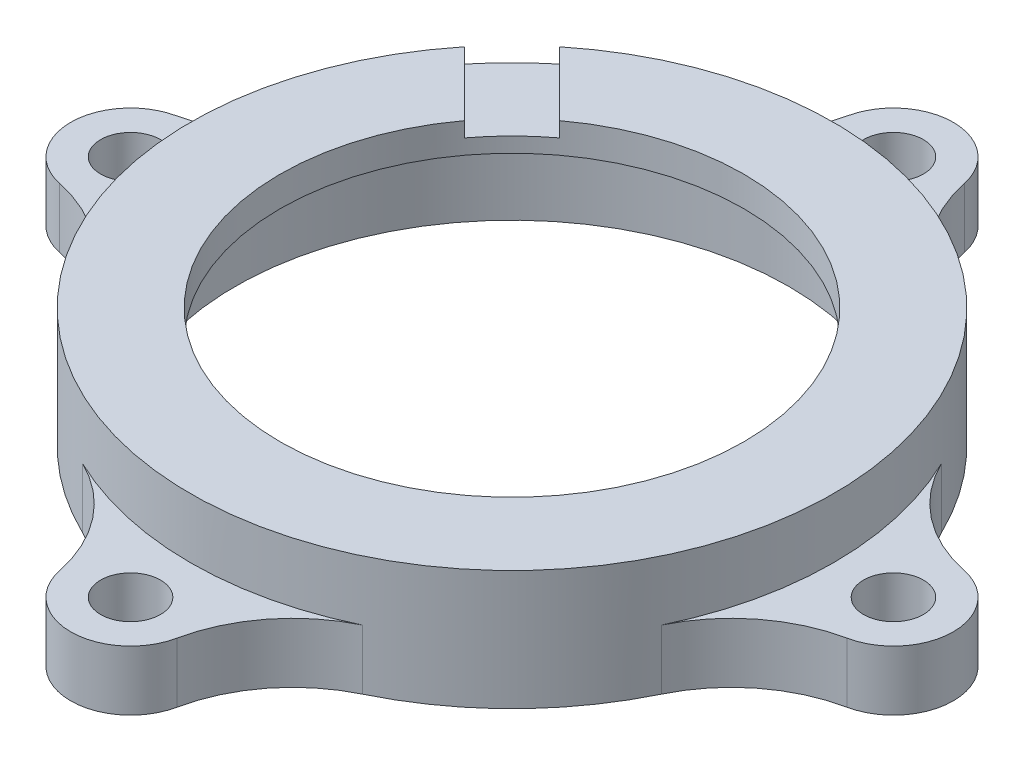
ISO-10303-21;
HEADER;
FILE_DESCRIPTION(('STEP AP214'),'2;1');
FILE_NAME('part.step','',(''),(''),'','','');
FILE_SCHEMA(('AUTOMOTIVE_DESIGN { 1 0 10303 214 1 1 1 1 }'));
ENDSEC;
DATA;
#1=APPLICATION_CONTEXT('core data for automotive mechanical design processes');
#2=APPLICATION_PROTOCOL_DEFINITION('international standard','automotive_design',2000,#1);
#3=PRODUCT_CONTEXT('',#1,'mechanical');
#4=PRODUCT('Part','Part','',(#3));
#5=PRODUCT_RELATED_PRODUCT_CATEGORY('part','',(#4));
#6=PRODUCT_DEFINITION_FORMATION('','',#4);
#7=PRODUCT_DEFINITION_CONTEXT('part definition',#1,'design');
#8=PRODUCT_DEFINITION('design','',#6,#7);
#9=PRODUCT_DEFINITION_SHAPE('','',#8);
#10=(LENGTH_UNIT() NAMED_UNIT(*) SI_UNIT(.MILLI.,.METRE.));
#11=(NAMED_UNIT(*) PLANE_ANGLE_UNIT() SI_UNIT($,.RADIAN.));
#12=(NAMED_UNIT(*) SI_UNIT($,.STERADIAN.) SOLID_ANGLE_UNIT());
#13=UNCERTAINTY_MEASURE_WITH_UNIT(LENGTH_MEASURE(1.E-05),#10,'distance_accuracy_value','');
#14=(GEOMETRIC_REPRESENTATION_CONTEXT(3) GLOBAL_UNCERTAINTY_ASSIGNED_CONTEXT((#13)) GLOBAL_UNIT_ASSIGNED_CONTEXT((#10,
#11,#12)) REPRESENTATION_CONTEXT('',''));
#15=CARTESIAN_POINT('',(0.,0.,0.));
#16=DIRECTION('',(0.,0.,1.));
#17=DIRECTION('',(1.,0.,0.));
#18=AXIS2_PLACEMENT_3D('',#15,#16,#17);
#19=CARTESIAN_POINT('',(0.,4.,0.));
#20=DIRECTION('',(0.,-1.,0.));
#21=DIRECTION('',(0.,0.,-1.));
#22=AXIS2_PLACEMENT_3D('',#19,#20,#21);
#23=CYLINDRICAL_SURFACE('',#22,15.5);
#24=DIRECTION('',(0.,-1.,0.));
#25=VECTOR('',#24,1.);
#26=CARTESIAN_POINT('',(-12.4350554548179,4.,-9.25307493947836));
#27=LINE('',#26,#25);
#28=CARTESIAN_POINT('',(-12.4350554548179,4.,-9.25307493947836));
#29=VERTEX_POINT('',#28);
#30=CARTESIAN_POINT('',(-12.4350554548179,3.,-9.25307493947836));
#31=VERTEX_POINT('',#30);
#32=EDGE_CURVE('E181',#29,#31,#27,.T.);
#33=ORIENTED_EDGE('',*,*,#32,.F.);
#34=CARTESIAN_POINT('',(0.,4.,0.));
#35=DIRECTION('',(0.,1.,0.));
#36=DIRECTION('',(0.,0.,1.));
#37=AXIS2_PLACEMENT_3D('',#34,#35,#36);
#38=CIRCLE('',#37,15.5);
#39=CARTESIAN_POINT('',(-9.2530749394785,4.,-12.4350554548178));
#40=VERTEX_POINT('',#39);
#41=EDGE_CURVE('E189',#29,#40,#38,.T.);
#42=ORIENTED_EDGE('',*,*,#41,.T.);
#43=DIRECTION('',(0.,-1.,0.));
#44=VECTOR('',#43,1.);
#45=CARTESIAN_POINT('',(-9.2530749394785,4.,-12.4350554548178));
#46=LINE('',#45,#44);
#47=CARTESIAN_POINT('',(-9.2530749394785,3.,-12.4350554548178));
#48=VERTEX_POINT('',#47);
#49=EDGE_CURVE('E173',#48,#40,#46,.F.);
#50=ORIENTED_EDGE('',*,*,#49,.F.);
#51=CARTESIAN_POINT('',(0.,3.,0.));
#52=DIRECTION('',(0.,-1.,0.));
#53=DIRECTION('',(0.,0.,-1.));
#54=AXIS2_PLACEMENT_3D('',#51,#52,#53);
#55=CIRCLE('',#54,15.5);
#56=EDGE_CURVE('E182',#31,#48,#55,.T.);
#57=ORIENTED_EDGE('',*,*,#56,.F.);
#58=EDGE_LOOP('',(#33,#42,#50,#57));
#59=FACE_BOUND('',#58,.T.);
#60=CARTESIAN_POINT('',(0.,2.,0.));
#61=DIRECTION('',(0.,-1.,0.));
#62=DIRECTION('',(0.,0.,-1.));
#63=AXIS2_PLACEMENT_3D('',#60,#61,#62);
#64=CIRCLE('',#63,15.5);
#65=CARTESIAN_POINT('',(0.,2.,-15.5));
#66=VERTEX_POINT('',#65);
#67=EDGE_CURVE('E206',#66,#66,#64,.T.);
#68=ORIENTED_EDGE('',*,*,#67,.T.);
#69=EDGE_LOOP('',(#68));
#70=FACE_BOUND('',#69,.T.);
#71=ADVANCED_FACE('F36',(#59,#70),#23,.F.);
#72=CARTESIAN_POINT('',(0.,4.,0.));
#73=DIRECTION('',(0.,1.,0.));
#74=DIRECTION('',(0.,0.,1.));
#75=AXIS2_PLACEMENT_3D('',#72,#73,#74);
#76=PLANE('',#75);
#77=DIRECTION('',(0.707106781186548,0.,0.707106781186547));
#78=VECTOR('',#77,1.);
#79=CARTESIAN_POINT('',(-11.849248678401,4.,-8.66726816306138));
#80=LINE('',#79,#78);
#81=CARTESIAN_POINT('',(-16.7103073718783,4.,-13.5283268565388));
#82=VERTEX_POINT('',#81);
#83=EDGE_CURVE('E192',#82,#29,#80,.T.);
#84=ORIENTED_EDGE('',*,*,#83,.F.);
#85=CARTESIAN_POINT('',(0.,4.,0.));
#86=DIRECTION('',(0.,1.,0.));
#87=DIRECTION('',(0.,0.,1.));
#88=AXIS2_PLACEMENT_3D('',#85,#86,#87);
#89=CIRCLE('',#88,21.5);
#90=CARTESIAN_POINT('',(-13.5283268565389,4.,-16.7103073718782));
#91=VERTEX_POINT('',#90);
#92=EDGE_CURVE('E191',#82,#91,#89,.T.);
#93=ORIENTED_EDGE('',*,*,#92,.T.);
#94=DIRECTION('',(-0.707106781186548,0.,-0.707106781186547));
#95=VECTOR('',#94,1.);
#96=CARTESIAN_POINT('',(-8.6672681630615,4.,-11.8492486784008));
#97=LINE('',#96,#95);
#98=EDGE_CURVE('E176',#40,#91,#97,.T.);
#99=ORIENTED_EDGE('',*,*,#98,.F.);
#100=ORIENTED_EDGE('',*,*,#41,.F.);
#101=EDGE_LOOP('',(#84,#93,#99,#100));
#102=FACE_BOUND('',#101,.T.);
#103=ADVANCED_FACE('F188',(#102),#76,.T.);
#104=CARTESIAN_POINT('',(0.,4.,0.));
#105=DIRECTION('',(0.,-1.,0.));
#106=DIRECTION('',(0.,0.,-1.));
#107=AXIS2_PLACEMENT_3D('',#104,#105,#106);
#108=CYLINDRICAL_SURFACE('',#107,21.5);
#109=ORIENTED_EDGE('',*,*,#92,.F.);
#110=DIRECTION('',(0.,-1.,0.));
#111=VECTOR('',#110,1.);
#112=CARTESIAN_POINT('',(-16.7103073718783,4.,-13.5283268565388));
#113=LINE('',#112,#111);
#114=CARTESIAN_POINT('',(-16.7103073718783,3.,-13.5283268565388));
#115=VERTEX_POINT('',#114);
#116=EDGE_CURVE('E11',#82,#115,#113,.T.);
#117=ORIENTED_EDGE('',*,*,#116,.T.);
#118=CARTESIAN_POINT('',(0.,3.,0.));
#119=DIRECTION('',(0.,-1.,0.));
#120=DIRECTION('',(0.,0.,-1.));
#121=AXIS2_PLACEMENT_3D('',#118,#119,#120);
#122=CIRCLE('',#121,21.5);
#123=CARTESIAN_POINT('',(-13.5283268565389,3.,-16.7103073718782));
#124=VERTEX_POINT('',#123);
#125=EDGE_CURVE('E293',#115,#124,#122,.T.);
#126=ORIENTED_EDGE('',*,*,#125,.T.);
#127=DIRECTION('',(0.,-1.,0.));
#128=VECTOR('',#127,1.);
#129=CARTESIAN_POINT('',(-13.5283268565389,4.,-16.7103073718782));
#130=LINE('',#129,#128);
#131=EDGE_CURVE('E44',#124,#91,#130,.F.);
#132=ORIENTED_EDGE('',*,*,#131,.T.);
#133=EDGE_LOOP('',(#109,#117,#126,#132));
#134=FACE_BOUND('',#133,.T.);
#135=CARTESIAN_POINT('',(0.,-4.,0.));
#136=DIRECTION('',(0.,-1.,0.));
#137=DIRECTION('',(0.,0.,-1.));
#138=AXIS2_PLACEMENT_3D('',#135,#136,#137);
#139=CIRCLE('',#138,21.5);
#140=CARTESIAN_POINT('',(-9.35365017871444,-4.,19.3586990351685));
#141=VERTEX_POINT('',#140);
#142=CARTESIAN_POINT('',(-19.3586990351696,-4.,9.3536501787122));
#143=VERTEX_POINT('',#142);
#144=EDGE_CURVE('E203',#141,#143,#139,.T.);
#145=ORIENTED_EDGE('',*,*,#144,.F.);
#146=DIRECTION('',(0.,-1.,0.));
#147=VECTOR('',#146,1.);
#148=CARTESIAN_POINT('',(-9.35365017871444,4.,19.3586990351685));
#149=LINE('',#148,#147);
#150=CARTESIAN_POINT('',(-9.35365017871444,0.,19.3586990351685));
#151=VERTEX_POINT('',#150);
#152=EDGE_CURVE('E239',#141,#151,#149,.F.);
#153=ORIENTED_EDGE('',*,*,#152,.T.);
#154=CARTESIAN_POINT('',(0.,0.,0.));
#155=DIRECTION('',(0.,-1.,0.));
#156=DIRECTION('',(0.,0.,-1.));
#157=AXIS2_PLACEMENT_3D('',#154,#155,#156);
#158=CIRCLE('',#157,21.5);
#159=CARTESIAN_POINT('',(9.35365017871107,0.,19.3586990351702));
#160=VERTEX_POINT('',#159);
#161=EDGE_CURVE('E212',#160,#151,#158,.T.);
#162=ORIENTED_EDGE('',*,*,#161,.F.);
#163=DIRECTION('',(0.,-1.,0.));
#164=VECTOR('',#163,1.);
#165=CARTESIAN_POINT('',(9.35365017871107,4.,19.3586990351702));
#166=LINE('',#165,#164);
#167=CARTESIAN_POINT('',(9.35365017871107,-4.,19.3586990351702));
#168=VERTEX_POINT('',#167);
#169=EDGE_CURVE('E218',#160,#168,#166,.T.);
#170=ORIENTED_EDGE('',*,*,#169,.T.);
#171=CARTESIAN_POINT('',(19.3586990351674,-4.,9.35365017871677));
#172=VERTEX_POINT('',#171);
#173=EDGE_CURVE('E362',#172,#168,#139,.T.);
#174=ORIENTED_EDGE('',*,*,#173,.F.);
#175=DIRECTION('',(0.,-1.,0.));
#176=VECTOR('',#175,1.);
#177=CARTESIAN_POINT('',(19.3586990351674,4.,9.35365017871677));
#178=LINE('',#177,#176);
#179=CARTESIAN_POINT('',(19.3586990351674,0.,9.35365017871677));
#180=VERTEX_POINT('',#179);
#181=EDGE_CURVE('E221',#172,#180,#178,.F.);
#182=ORIENTED_EDGE('',*,*,#181,.T.);
#183=CARTESIAN_POINT('',(0.,0.,0.));
#184=DIRECTION('',(0.,-1.,0.));
#185=DIRECTION('',(0.,0.,-1.));
#186=AXIS2_PLACEMENT_3D('',#183,#184,#185);
#187=CIRCLE('',#186,21.5);
#188=CARTESIAN_POINT('',(19.3586990351716,0.,-9.35365017870804));
#189=VERTEX_POINT('',#188);
#190=EDGE_CURVE('E214',#189,#180,#187,.T.);
#191=ORIENTED_EDGE('',*,*,#190,.F.);
#192=DIRECTION('',(0.,-1.,0.));
#193=VECTOR('',#192,1.);
#194=CARTESIAN_POINT('',(19.3586990351716,4.,-9.35365017870804));
#195=LINE('',#194,#193);
#196=CARTESIAN_POINT('',(19.3586990351716,-4.,-9.35365017870804));
#197=VERTEX_POINT('',#196);
#198=EDGE_CURVE('E224',#189,#197,#195,.T.);
#199=ORIENTED_EDGE('',*,*,#198,.T.);
#200=CARTESIAN_POINT('',(9.35365017871453,-4.,-19.3586990351685));
#201=VERTEX_POINT('',#200);
#202=EDGE_CURVE('E201',#201,#197,#139,.T.);
#203=ORIENTED_EDGE('',*,*,#202,.F.);
#204=DIRECTION('',(0.,-1.,0.));
#205=VECTOR('',#204,1.);
#206=CARTESIAN_POINT('',(9.35365017871453,4.,-19.3586990351685));
#207=LINE('',#206,#205);
#208=CARTESIAN_POINT('',(9.35365017871453,0.,-19.3586990351685));
#209=VERTEX_POINT('',#208);
#210=EDGE_CURVE('E236',#201,#209,#207,.F.);
#211=ORIENTED_EDGE('',*,*,#210,.T.);
#212=CARTESIAN_POINT('',(0.,0.,0.));
#213=DIRECTION('',(0.,-1.,0.));
#214=DIRECTION('',(0.,0.,-1.));
#215=AXIS2_PLACEMENT_3D('',#212,#213,#214);
#216=CIRCLE('',#215,21.5);
#217=CARTESIAN_POINT('',(-9.35365017870916,0.,-19.3586990351711));
#218=VERTEX_POINT('',#217);
#219=EDGE_CURVE('E216',#218,#209,#216,.T.);
#220=ORIENTED_EDGE('',*,*,#219,.F.);
#221=DIRECTION('',(0.,-1.,0.));
#222=VECTOR('',#221,1.);
#223=CARTESIAN_POINT('',(-9.35365017870916,4.,-19.3586990351711));
#224=LINE('',#223,#222);
#225=CARTESIAN_POINT('',(-9.35365017870916,-4.,-19.3586990351711));
#226=VERTEX_POINT('',#225);
#227=EDGE_CURVE('E227',#218,#226,#224,.T.);
#228=ORIENTED_EDGE('',*,*,#227,.T.);
#229=CARTESIAN_POINT('',(-19.3586990351696,-4.,-9.3536501787122));
#230=VERTEX_POINT('',#229);
#231=EDGE_CURVE('E196',#230,#226,#139,.T.);
#232=ORIENTED_EDGE('',*,*,#231,.F.);
#233=DIRECTION('',(0.,-1.,0.));
#234=VECTOR('',#233,1.);
#235=CARTESIAN_POINT('',(-19.3586990351696,4.,-9.3536501787122));
#236=LINE('',#235,#234);
#237=CARTESIAN_POINT('',(-19.3586990351696,0.,-9.3536501787122));
#238=VERTEX_POINT('',#237);
#239=EDGE_CURVE('E233',#230,#238,#236,.F.);
#240=ORIENTED_EDGE('',*,*,#239,.T.);
#241=CARTESIAN_POINT('',(0.,0.,0.));
#242=DIRECTION('',(0.,-1.,0.));
#243=DIRECTION('',(0.,0.,-1.));
#244=AXIS2_PLACEMENT_3D('',#241,#242,#243);
#245=CIRCLE('',#244,21.5);
#246=CARTESIAN_POINT('',(-19.3586990351696,0.,9.3536501787122));
#247=VERTEX_POINT('',#246);
#248=EDGE_CURVE('E198',#247,#238,#245,.T.);
#249=ORIENTED_EDGE('',*,*,#248,.F.);
#250=DIRECTION('',(0.,-1.,0.));
#251=VECTOR('',#250,1.);
#252=CARTESIAN_POINT('',(-19.3586990351696,4.,9.3536501787122));
#253=LINE('',#252,#251);
#254=EDGE_CURVE('E230',#247,#143,#253,.T.);
#255=ORIENTED_EDGE('',*,*,#254,.T.);
#256=EDGE_LOOP('',(#145,#153,#162,#170,#174,#182,#191,#199,#203,#211,#220,#228,#232,#240,#249,#255));
#257=FACE_BOUND('',#256,.T.);
#258=ADVANCED_FACE('F296',(#134,#257),#108,.T.);
#259=CARTESIAN_POINT('',(0.,-4.,0.));
#260=DIRECTION('',(0.,-1.,0.));
#261=DIRECTION('',(0.,0.,-1.));
#262=AXIS2_PLACEMENT_3D('',#259,#260,#261);
#263=PLANE('',#262);
#264=CARTESIAN_POINT('',(-25.5,-4.,0.));
#265=DIRECTION('',(0.,-1.,0.));
#266=DIRECTION('',(0.,0.,-1.));
#267=AXIS2_PLACEMENT_3D('',#264,#265,#266);
#268=CIRCLE('',#267,4.);
#269=CARTESIAN_POINT('',(-26.3179271708683,-4.,3.91548147015859));
#270=VERTEX_POINT('',#269);
#271=CARTESIAN_POINT('',(-26.3179271708683,-4.,-3.91548147015859));
#272=VERTEX_POINT('',#271);
#273=EDGE_CURVE('E349',#270,#272,#268,.T.);
#274=ORIENTED_EDGE('',*,*,#273,.T.);
#275=CARTESIAN_POINT('',(-28.3627450980392,-4.,-13.7041851455551));
#276=DIRECTION('',(0.,-1.,0.));
#277=DIRECTION('',(0.,0.,-1.));
#278=AXIS2_PLACEMENT_3D('',#275,#276,#277);
#279=CIRCLE('',#278,10.);
#280=EDGE_CURVE('E268',#272,#230,#279,.F.);
#281=ORIENTED_EDGE('',*,*,#280,.T.);
#282=ORIENTED_EDGE('',*,*,#231,.T.);
#283=CARTESIAN_POINT('',(-13.7041851455506,-4.,-28.3627450980414));
#284=DIRECTION('',(0.,-1.,0.));
#285=DIRECTION('',(0.,0.,-1.));
#286=AXIS2_PLACEMENT_3D('',#283,#284,#285);
#287=CIRCLE('',#286,10.);
#288=CARTESIAN_POINT('',(-3.9154814701548,-4.,-26.3179271708674));
#289=VERTEX_POINT('',#288);
#290=EDGE_CURVE('E275',#226,#289,#287,.F.);
#291=ORIENTED_EDGE('',*,*,#290,.T.);
#292=CARTESIAN_POINT('',(3.53571390935753E-12,-4.,-25.4999999999978));
#293=DIRECTION('',(0.,-1.,0.));
#294=DIRECTION('',(0.,0.,-1.));
#295=AXIS2_PLACEMENT_3D('',#292,#293,#294);
#296=CIRCLE('',#295,4.);
#297=CARTESIAN_POINT('',(3.9154814701621,-4.,-26.3179271708663));
#298=VERTEX_POINT('',#297);
#299=EDGE_CURVE('E311',#289,#298,#296,.T.);
#300=ORIENTED_EDGE('',*,*,#299,.T.);
#301=CARTESIAN_POINT('',(13.7041851455585,-4.,-28.3627450980376));
#302=DIRECTION('',(0.,-1.,0.));
#303=DIRECTION('',(0.,0.,-1.));
#304=AXIS2_PLACEMENT_3D('',#301,#302,#303);
#305=CIRCLE('',#304,10.);
#306=EDGE_CURVE('E264',#298,#201,#305,.F.);
#307=ORIENTED_EDGE('',*,*,#306,.T.);
#308=ORIENTED_EDGE('',*,*,#202,.T.);
#309=CARTESIAN_POINT('',(28.3627450980422,-4.,-13.704185145549));
#310=DIRECTION('',(0.,-1.,0.));
#311=DIRECTION('',(0.,0.,-1.));
#312=AXIS2_PLACEMENT_3D('',#309,#310,#311);
#313=CIRCLE('',#312,10.);
#314=CARTESIAN_POINT('',(26.3179271708701,-4.,-3.91548147015274));
#315=VERTEX_POINT('',#314);
#316=EDGE_CURVE('E280',#197,#315,#313,.F.);
#317=ORIENTED_EDGE('',*,*,#316,.T.);
#318=CARTESIAN_POINT('',(25.5000000000013,-4.,5.75373117220094E-12));
#319=DIRECTION('',(0.,-1.,0.));
#320=DIRECTION('',(0.,0.,-1.));
#321=AXIS2_PLACEMENT_3D('',#318,#319,#320);
#322=CIRCLE('',#321,4.);
#323=CARTESIAN_POINT('',(26.3179271708684,-4.,3.91548147016462));
#324=VERTEX_POINT('',#323);
#325=EDGE_CURVE('E323',#315,#324,#322,.T.);
#326=ORIENTED_EDGE('',*,*,#325,.T.);
#327=CARTESIAN_POINT('',(28.362745098036,-4.,13.7041851455618));
#328=DIRECTION('',(0.,-1.,0.));
#329=DIRECTION('',(0.,0.,-1.));
#330=AXIS2_PLACEMENT_3D('',#327,#328,#329);
#331=CIRCLE('',#330,10.);
#332=EDGE_CURVE('E286',#324,#172,#331,.F.);
#333=ORIENTED_EDGE('',*,*,#332,.T.);
#334=ORIENTED_EDGE('',*,*,#173,.T.);
#335=CARTESIAN_POINT('',(13.7041851455534,-4.,28.36274509804));
#336=DIRECTION('',(0.,-1.,0.));
#337=DIRECTION('',(0.,0.,-1.));
#338=AXIS2_PLACEMENT_3D('',#335,#336,#337);
#339=CIRCLE('',#338,10.);
#340=CARTESIAN_POINT('',(3.91548147015654,-4.,26.3179271708711));
#341=VERTEX_POINT('',#340);
#342=EDGE_CURVE('E288',#168,#341,#339,.F.);
#343=ORIENTED_EDGE('',*,*,#342,.T.);
#344=CARTESIAN_POINT('',(-2.22114011218124E-12,-4.,25.5000000000035));
#345=DIRECTION('',(0.,-1.,0.));
#346=DIRECTION('',(0.,0.,-1.));
#347=AXIS2_PLACEMENT_3D('',#344,#345,#346);
#348=CIRCLE('',#347,4.);
#349=CARTESIAN_POINT('',(-3.91548147016112,-4.,26.3179271708704));
#350=VERTEX_POINT('',#349);
#351=EDGE_CURVE('E334',#341,#350,#348,.T.);
#352=ORIENTED_EDGE('',*,*,#351,.T.);
#353=CARTESIAN_POINT('',(-13.7041851455584,-4.,28.3627450980376));
#354=DIRECTION('',(0.,-1.,0.));
#355=DIRECTION('',(0.,0.,-1.));
#356=AXIS2_PLACEMENT_3D('',#353,#354,#355);
#357=CIRCLE('',#356,10.);
#358=EDGE_CURVE('E260',#350,#141,#357,.F.);
#359=ORIENTED_EDGE('',*,*,#358,.T.);
#360=ORIENTED_EDGE('',*,*,#144,.T.);
#361=CARTESIAN_POINT('',(-28.3627450980392,-4.,13.7041851455551));
#362=DIRECTION('',(0.,-1.,0.));
#363=DIRECTION('',(0.,0.,-1.));
#364=AXIS2_PLACEMENT_3D('',#361,#362,#363);
#365=CIRCLE('',#364,10.);
#366=EDGE_CURVE('E270',#143,#270,#365,.F.);
#367=ORIENTED_EDGE('',*,*,#366,.T.);
#368=EDGE_LOOP('',(#274,#281,#282,#291,#300,#307,#308,#317,#326,#333,#334,#343,#352,#359,#360,#367));
#369=FACE_BOUND('',#368,.T.);
#370=CARTESIAN_POINT('',(0.,-4.,0.));
#371=DIRECTION('',(0.,-1.,0.));
#372=DIRECTION('',(0.,0.,-1.));
#373=AXIS2_PLACEMENT_3D('',#370,#371,#372);
#374=CIRCLE('',#373,18.5);
#375=CARTESIAN_POINT('',(0.,-4.,-18.5));
#376=VERTEX_POINT('',#375);
#377=EDGE_CURVE('E209',#376,#376,#374,.T.);
#378=ORIENTED_EDGE('',*,*,#377,.F.);
#379=EDGE_LOOP('',(#378));
#380=FACE_BOUND('',#379,.T.);
#381=CARTESIAN_POINT('',(-25.5,-4.,0.));
#382=DIRECTION('',(0.,-1.,0.));
#383=DIRECTION('',(0.,0.,-1.));
#384=AXIS2_PLACEMENT_3D('',#381,#382,#383);
#385=CIRCLE('',#384,2.);
#386=CARTESIAN_POINT('',(-25.5,-4.,-2.));
#387=VERTEX_POINT('',#386);
#388=EDGE_CURVE('E343',#387,#387,#385,.T.);
#389=ORIENTED_EDGE('',*,*,#388,.F.);
#390=EDGE_LOOP('',(#389));
#391=FACE_BOUND('',#390,.T.);
#392=CARTESIAN_POINT('',(-2.22114011218124E-12,-4.,25.5000000000035));
#393=DIRECTION('',(0.,-1.,0.));
#394=DIRECTION('',(0.,0.,-1.));
#395=AXIS2_PLACEMENT_3D('',#392,#393,#394);
#396=CIRCLE('',#395,2.);
#397=CARTESIAN_POINT('',(-2.22114011218124E-12,-4.,23.5000000000035));
#398=VERTEX_POINT('',#397);
#399=EDGE_CURVE('E340',#398,#398,#396,.T.);
#400=ORIENTED_EDGE('',*,*,#399,.F.);
#401=EDGE_LOOP('',(#400));
#402=FACE_BOUND('',#401,.T.);
#403=CARTESIAN_POINT('',(25.5000000000013,-4.,5.75373117220094E-12));
#404=DIRECTION('',(0.,-1.,0.));
#405=DIRECTION('',(0.,0.,-1.));
#406=AXIS2_PLACEMENT_3D('',#403,#404,#405);
#407=CIRCLE('',#406,2.);
#408=CARTESIAN_POINT('',(25.5000000000013,-4.,-1.99999999999425));
#409=VERTEX_POINT('',#408);
#410=EDGE_CURVE('E328',#409,#409,#407,.T.);
#411=ORIENTED_EDGE('',*,*,#410,.F.);
#412=EDGE_LOOP('',(#411));
#413=FACE_BOUND('',#412,.T.);
#414=CARTESIAN_POINT('',(3.53571390935753E-12,-4.,-25.4999999999978));
#415=DIRECTION('',(0.,-1.,0.));
#416=DIRECTION('',(0.,0.,-1.));
#417=AXIS2_PLACEMENT_3D('',#414,#415,#416);
#418=CIRCLE('',#417,2.);
#419=CARTESIAN_POINT('',(3.53571390935753E-12,-4.,-27.4999999999978));
#420=VERTEX_POINT('',#419);
#421=EDGE_CURVE('E317',#420,#420,#418,.T.);
#422=ORIENTED_EDGE('',*,*,#421,.F.);
#423=EDGE_LOOP('',(#422));
#424=FACE_BOUND('',#423,.T.);
#425=ADVANCED_FACE('F369',(#369,#380,#391,#402,#413,#424),#263,.T.);
#426=CARTESIAN_POINT('',(0.,-4.,0.));
#427=DIRECTION('',(0.,1.,0.));
#428=DIRECTION('',(0.,0.,1.));
#429=AXIS2_PLACEMENT_3D('',#426,#427,#428);
#430=CYLINDRICAL_SURFACE('',#429,18.5);
#431=ORIENTED_EDGE('',*,*,#377,.T.);
#432=EDGE_LOOP('',(#431));
#433=FACE_BOUND('',#432,.T.);
#434=CARTESIAN_POINT('',(0.,2.,0.));
#435=DIRECTION('',(0.,-1.,0.));
#436=DIRECTION('',(0.,0.,-1.));
#437=AXIS2_PLACEMENT_3D('',#434,#435,#436);
#438=CIRCLE('',#437,18.5);
#439=CARTESIAN_POINT('',(0.,2.,-18.5));
#440=VERTEX_POINT('',#439);
#441=EDGE_CURVE('E210',#440,#440,#438,.T.);
#442=ORIENTED_EDGE('',*,*,#441,.F.);
#443=EDGE_LOOP('',(#442));
#444=FACE_BOUND('',#443,.T.);
#445=ADVANCED_FACE('F418',(#433,#444),#430,.F.);
#446=CARTESIAN_POINT('',(0.,2.,0.));
#447=DIRECTION('',(0.,-1.,0.));
#448=DIRECTION('',(0.,0.,-1.));
#449=AXIS2_PLACEMENT_3D('',#446,#447,#448);
#450=PLANE('',#449);
#451=ORIENTED_EDGE('',*,*,#67,.F.);
#452=EDGE_LOOP('',(#451));
#453=FACE_BOUND('',#452,.T.);
#454=ORIENTED_EDGE('',*,*,#441,.T.);
#455=EDGE_LOOP('',(#454));
#456=FACE_BOUND('',#455,.T.);
#457=ADVANCED_FACE('F409',(#453,#456),#450,.T.);
#458=CARTESIAN_POINT('',(-25.5,0.,0.));
#459=DIRECTION('',(0.,-1.,0.));
#460=DIRECTION('',(0.,0.,-1.));
#461=AXIS2_PLACEMENT_3D('',#458,#459,#460);
#462=CYLINDRICAL_SURFACE('',#461,4.);
#463=CARTESIAN_POINT('',(-25.5,0.,0.));
#464=DIRECTION('',(0.,-1.,0.));
#465=DIRECTION('',(0.,0.,-1.));
#466=AXIS2_PLACEMENT_3D('',#463,#464,#465);
#467=CIRCLE('',#466,4.);
#468=CARTESIAN_POINT('',(-26.3179271708683,0.,3.91548147015859));
#469=VERTEX_POINT('',#468);
#470=CARTESIAN_POINT('',(-26.3179271708683,0.,-3.91548147015859));
#471=VERTEX_POINT('',#470);
#472=EDGE_CURVE('E352',#469,#471,#467,.T.);
#473=ORIENTED_EDGE('',*,*,#472,.T.);
#474=DIRECTION('',(0.,-1.,0.));
#475=VECTOR('',#474,1.);
#476=CARTESIAN_POINT('',(-26.3179271708683,0.,-3.9154814701586));
#477=LINE('',#476,#475);
#478=EDGE_CURVE('E252',#471,#272,#477,.T.);
#479=ORIENTED_EDGE('',*,*,#478,.T.);
#480=ORIENTED_EDGE('',*,*,#273,.F.);
#481=DIRECTION('',(0.,-1.,0.));
#482=VECTOR('',#481,1.);
#483=CARTESIAN_POINT('',(-26.3179271708683,0.,3.9154814701586));
#484=LINE('',#483,#482);
#485=EDGE_CURVE('E250',#270,#469,#484,.F.);
#486=ORIENTED_EDGE('',*,*,#485,.T.);
#487=EDGE_LOOP('',(#473,#479,#480,#486));
#488=FACE_BOUND('',#487,.T.);
#489=ADVANCED_FACE('F407',(#488),#462,.T.);
#490=CARTESIAN_POINT('',(-25.5,0.,0.));
#491=DIRECTION('',(0.,-1.,0.));
#492=DIRECTION('',(0.,0.,-1.));
#493=AXIS2_PLACEMENT_3D('',#490,#491,#492);
#494=PLANE('',#493);
#495=CARTESIAN_POINT('',(-25.5,0.,0.));
#496=DIRECTION('',(0.,-1.,0.));
#497=DIRECTION('',(0.,0.,-1.));
#498=AXIS2_PLACEMENT_3D('',#495,#496,#497);
#499=CIRCLE('',#498,2.);
#500=CARTESIAN_POINT('',(-25.5,0.,-2.));
#501=VERTEX_POINT('',#500);
#502=EDGE_CURVE('E346',#501,#501,#499,.T.);
#503=ORIENTED_EDGE('',*,*,#502,.T.);
#504=EDGE_LOOP('',(#503));
#505=FACE_BOUND('',#504,.T.);
#506=ORIENTED_EDGE('',*,*,#472,.F.);
#507=CARTESIAN_POINT('',(-28.3627450980392,0.,13.7041851455551));
#508=DIRECTION('',(0.,-1.,0.));
#509=DIRECTION('',(0.,0.,-1.));
#510=AXIS2_PLACEMENT_3D('',#507,#508,#509);
#511=CIRCLE('',#510,10.);
#512=EDGE_CURVE('E272',#469,#247,#511,.T.);
#513=ORIENTED_EDGE('',*,*,#512,.T.);
#514=ORIENTED_EDGE('',*,*,#248,.T.);
#515=CARTESIAN_POINT('',(-28.3627450980392,0.,-13.7041851455551));
#516=DIRECTION('',(0.,-1.,0.));
#517=DIRECTION('',(0.,0.,-1.));
#518=AXIS2_PLACEMENT_3D('',#515,#516,#517);
#519=CIRCLE('',#518,10.);
#520=EDGE_CURVE('E266',#238,#471,#519,.T.);
#521=ORIENTED_EDGE('',*,*,#520,.T.);
#522=EDGE_LOOP('',(#506,#513,#514,#521));
#523=FACE_BOUND('',#522,.T.);
#524=ADVANCED_FACE('F402',(#505,#523),#494,.F.);
#525=CARTESIAN_POINT('',(-25.5,0.,0.));
#526=DIRECTION('',(0.,-1.,0.));
#527=DIRECTION('',(0.,0.,-1.));
#528=AXIS2_PLACEMENT_3D('',#525,#526,#527);
#529=CYLINDRICAL_SURFACE('',#528,2.);
#530=ORIENTED_EDGE('',*,*,#502,.F.);
#531=EDGE_LOOP('',(#530));
#532=FACE_BOUND('',#531,.T.);
#533=ORIENTED_EDGE('',*,*,#388,.T.);
#534=EDGE_LOOP('',(#533));
#535=FACE_BOUND('',#534,.T.);
#536=ADVANCED_FACE('F415',(#532,#535),#529,.F.);
#537=CARTESIAN_POINT('',(-2.22114011218124E-12,0.,25.5000000000035));
#538=DIRECTION('',(0.,-1.,0.));
#539=DIRECTION('',(0.,0.,-1.));
#540=AXIS2_PLACEMENT_3D('',#537,#538,#539);
#541=CYLINDRICAL_SURFACE('',#540,4.);
#542=CARTESIAN_POINT('',(-2.22114011218124E-12,0.,25.5000000000035));
#543=DIRECTION('',(0.,-1.,0.));
#544=DIRECTION('',(0.,0.,-1.));
#545=AXIS2_PLACEMENT_3D('',#542,#543,#544);
#546=CIRCLE('',#545,4.);
#547=CARTESIAN_POINT('',(3.91548147015654,0.,26.3179271708711));
#548=VERTEX_POINT('',#547);
#549=CARTESIAN_POINT('',(-3.91548147016112,0.,26.3179271708704));
#550=VERTEX_POINT('',#549);
#551=EDGE_CURVE('E331',#548,#550,#546,.T.);
#552=ORIENTED_EDGE('',*,*,#551,.T.);
#553=DIRECTION('',(0.,-1.,0.));
#554=VECTOR('',#553,1.);
#555=CARTESIAN_POINT('',(-3.91548147016112,0.,26.3179271708704));
#556=LINE('',#555,#554);
#557=EDGE_CURVE('E244',#550,#350,#556,.T.);
#558=ORIENTED_EDGE('',*,*,#557,.T.);
#559=ORIENTED_EDGE('',*,*,#351,.F.);
#560=DIRECTION('',(0.,-1.,0.));
#561=VECTOR('',#560,1.);
#562=CARTESIAN_POINT('',(3.91548147015654,0.,26.3179271708711));
#563=LINE('',#562,#561);
#564=EDGE_CURVE('E242',#341,#548,#563,.F.);
#565=ORIENTED_EDGE('',*,*,#564,.T.);
#566=EDGE_LOOP('',(#552,#558,#559,#565));
#567=FACE_BOUND('',#566,.T.);
#568=ADVANCED_FACE('F464',(#567),#541,.T.);
#569=CARTESIAN_POINT('',(-2.22114011218124E-12,0.,25.5000000000035));
#570=DIRECTION('',(0.,-1.,0.));
#571=DIRECTION('',(0.,0.,-1.));
#572=AXIS2_PLACEMENT_3D('',#569,#570,#571);
#573=PLANE('',#572);
#574=CARTESIAN_POINT('',(-2.22114011218124E-12,0.,25.5000000000035));
#575=DIRECTION('',(0.,-1.,0.));
#576=DIRECTION('',(0.,0.,-1.));
#577=AXIS2_PLACEMENT_3D('',#574,#575,#576);
#578=CIRCLE('',#577,2.);
#579=CARTESIAN_POINT('',(-2.22114011218124E-12,0.,23.5000000000035));
#580=VERTEX_POINT('',#579);
#581=EDGE_CURVE('E337',#580,#580,#578,.T.);
#582=ORIENTED_EDGE('',*,*,#581,.T.);
#583=EDGE_LOOP('',(#582));
#584=FACE_BOUND('',#583,.T.);
#585=ORIENTED_EDGE('',*,*,#551,.F.);
#586=CARTESIAN_POINT('',(13.7041851455534,0.,28.36274509804));
#587=DIRECTION('',(0.,-1.,0.));
#588=DIRECTION('',(0.,0.,-1.));
#589=AXIS2_PLACEMENT_3D('',#586,#587,#588);
#590=CIRCLE('',#589,10.);
#591=EDGE_CURVE('E290',#548,#160,#590,.T.);
#592=ORIENTED_EDGE('',*,*,#591,.T.);
#593=ORIENTED_EDGE('',*,*,#161,.T.);
#594=CARTESIAN_POINT('',(-13.7041851455584,0.,28.3627450980376));
#595=DIRECTION('',(0.,-1.,0.));
#596=DIRECTION('',(0.,0.,-1.));
#597=AXIS2_PLACEMENT_3D('',#594,#595,#596);
#598=CIRCLE('',#597,10.);
#599=EDGE_CURVE('E258',#151,#550,#598,.T.);
#600=ORIENTED_EDGE('',*,*,#599,.T.);
#601=EDGE_LOOP('',(#585,#592,#593,#600));
#602=FACE_BOUND('',#601,.T.);
#603=ADVANCED_FACE('F470',(#584,#602),#573,.F.);
#604=CARTESIAN_POINT('',(-2.22114011218124E-12,0.,25.5000000000035));
#605=DIRECTION('',(0.,-1.,0.));
#606=DIRECTION('',(0.,0.,-1.));
#607=AXIS2_PLACEMENT_3D('',#604,#605,#606);
#608=CYLINDRICAL_SURFACE('',#607,2.);
#609=ORIENTED_EDGE('',*,*,#581,.F.);
#610=EDGE_LOOP('',(#609));
#611=FACE_BOUND('',#610,.T.);
#612=ORIENTED_EDGE('',*,*,#399,.T.);
#613=EDGE_LOOP('',(#612));
#614=FACE_BOUND('',#613,.T.);
#615=ADVANCED_FACE('F472',(#611,#614),#608,.F.);
#616=CARTESIAN_POINT('',(25.5000000000013,0.,5.75373117220094E-12));
#617=DIRECTION('',(0.,-1.,0.));
#618=DIRECTION('',(0.,0.,-1.));
#619=AXIS2_PLACEMENT_3D('',#616,#617,#618);
#620=CYLINDRICAL_SURFACE('',#619,4.);
#621=ORIENTED_EDGE('',*,*,#325,.F.);
#622=DIRECTION('',(0.,-1.,0.));
#623=VECTOR('',#622,1.);
#624=CARTESIAN_POINT('',(26.3179271708701,0.,-3.91548147015274));
#625=LINE('',#624,#623);
#626=CARTESIAN_POINT('',(26.3179271708701,0.,-3.91548147015274));
#627=VERTEX_POINT('',#626);
#628=EDGE_CURVE('E256',#315,#627,#625,.F.);
#629=ORIENTED_EDGE('',*,*,#628,.T.);
#630=CARTESIAN_POINT('',(25.5000000000013,0.,5.75373117220094E-12));
#631=DIRECTION('',(0.,-1.,0.));
#632=DIRECTION('',(0.,0.,-1.));
#633=AXIS2_PLACEMENT_3D('',#630,#631,#632);
#634=CIRCLE('',#633,4.);
#635=CARTESIAN_POINT('',(26.3179271708684,0.,3.91548147016462));
#636=VERTEX_POINT('',#635);
#637=EDGE_CURVE('E320',#627,#636,#634,.T.);
#638=ORIENTED_EDGE('',*,*,#637,.T.);
#639=DIRECTION('',(0.,-1.,0.));
#640=VECTOR('',#639,1.);
#641=CARTESIAN_POINT('',(26.3179271708684,0.,3.91548147016462));
#642=LINE('',#641,#640);
#643=EDGE_CURVE('E254',#636,#324,#642,.T.);
#644=ORIENTED_EDGE('',*,*,#643,.T.);
#645=EDGE_LOOP('',(#621,#629,#638,#644));
#646=FACE_BOUND('',#645,.T.);
#647=ADVANCED_FACE('F479',(#646),#620,.T.);
#648=CARTESIAN_POINT('',(25.5000000000013,0.,5.75373117220094E-12));
#649=DIRECTION('',(0.,-1.,0.));
#650=DIRECTION('',(0.,0.,-1.));
#651=AXIS2_PLACEMENT_3D('',#648,#649,#650);
#652=PLANE('',#651);
#653=CARTESIAN_POINT('',(25.5000000000013,0.,5.75373117220094E-12));
#654=DIRECTION('',(0.,-1.,0.));
#655=DIRECTION('',(0.,0.,-1.));
#656=AXIS2_PLACEMENT_3D('',#653,#654,#655);
#657=CIRCLE('',#656,2.);
#658=CARTESIAN_POINT('',(25.5000000000013,0.,-1.99999999999425));
#659=VERTEX_POINT('',#658);
#660=EDGE_CURVE('E326',#659,#659,#657,.T.);
#661=ORIENTED_EDGE('',*,*,#660,.T.);
#662=EDGE_LOOP('',(#661));
#663=FACE_BOUND('',#662,.T.);
#664=ORIENTED_EDGE('',*,*,#637,.F.);
#665=CARTESIAN_POINT('',(28.3627450980422,0.,-13.704185145549));
#666=DIRECTION('',(0.,-1.,0.));
#667=DIRECTION('',(0.,0.,-1.));
#668=AXIS2_PLACEMENT_3D('',#665,#666,#667);
#669=CIRCLE('',#668,10.);
#670=EDGE_CURVE('E282',#627,#189,#669,.T.);
#671=ORIENTED_EDGE('',*,*,#670,.T.);
#672=ORIENTED_EDGE('',*,*,#190,.T.);
#673=CARTESIAN_POINT('',(28.362745098036,0.,13.7041851455618));
#674=DIRECTION('',(0.,-1.,0.));
#675=DIRECTION('',(0.,0.,-1.));
#676=AXIS2_PLACEMENT_3D('',#673,#674,#675);
#677=CIRCLE('',#676,10.);
#678=EDGE_CURVE('E59',#180,#636,#677,.T.);
#679=ORIENTED_EDGE('',*,*,#678,.T.);
#680=EDGE_LOOP('',(#664,#671,#672,#679));
#681=FACE_BOUND('',#680,.T.);
#682=ADVANCED_FACE('F514',(#663,#681),#652,.F.);
#683=CARTESIAN_POINT('',(25.5000000000013,0.,5.75373117220094E-12));
#684=DIRECTION('',(0.,-1.,0.));
#685=DIRECTION('',(0.,0.,-1.));
#686=AXIS2_PLACEMENT_3D('',#683,#684,#685);
#687=CYLINDRICAL_SURFACE('',#686,2.);
#688=ORIENTED_EDGE('',*,*,#660,.F.);
#689=EDGE_LOOP('',(#688));
#690=FACE_BOUND('',#689,.T.);
#691=ORIENTED_EDGE('',*,*,#410,.T.);
#692=EDGE_LOOP('',(#691));
#693=FACE_BOUND('',#692,.T.);
#694=ADVANCED_FACE('F517',(#690,#693),#687,.F.);
#695=CARTESIAN_POINT('',(3.53571390935753E-12,0.,-25.4999999999978));
#696=DIRECTION('',(0.,-1.,0.));
#697=DIRECTION('',(0.,0.,-1.));
#698=AXIS2_PLACEMENT_3D('',#695,#696,#697);
#699=CYLINDRICAL_SURFACE('',#698,4.);
#700=CARTESIAN_POINT('',(3.53571390935753E-12,0.,-25.4999999999978));
#701=DIRECTION('',(0.,-1.,0.));
#702=DIRECTION('',(0.,0.,-1.));
#703=AXIS2_PLACEMENT_3D('',#700,#701,#702);
#704=CIRCLE('',#703,4.);
#705=CARTESIAN_POINT('',(-3.9154814701548,0.,-26.3179271708674));
#706=VERTEX_POINT('',#705);
#707=CARTESIAN_POINT('',(3.9154814701621,0.,-26.3179271708663));
#708=VERTEX_POINT('',#707);
#709=EDGE_CURVE('E310',#706,#708,#704,.T.);
#710=ORIENTED_EDGE('',*,*,#709,.T.);
#711=DIRECTION('',(0.,-1.,0.));
#712=VECTOR('',#711,1.);
#713=CARTESIAN_POINT('',(3.9154814701621,0.,-26.3179271708663));
#714=LINE('',#713,#712);
#715=EDGE_CURVE('E248',#708,#298,#714,.T.);
#716=ORIENTED_EDGE('',*,*,#715,.T.);
#717=ORIENTED_EDGE('',*,*,#299,.F.);
#718=DIRECTION('',(0.,-1.,0.));
#719=VECTOR('',#718,1.);
#720=CARTESIAN_POINT('',(-3.9154814701548,0.,-26.3179271708674));
#721=LINE('',#720,#719);
#722=EDGE_CURVE('E246',#289,#706,#721,.F.);
#723=ORIENTED_EDGE('',*,*,#722,.T.);
#724=EDGE_LOOP('',(#710,#716,#717,#723));
#725=FACE_BOUND('',#724,.T.);
#726=ADVANCED_FACE('F384',(#725),#699,.T.);
#727=CARTESIAN_POINT('',(3.53571390935753E-12,0.,-25.4999999999978));
#728=DIRECTION('',(0.,-1.,0.));
#729=DIRECTION('',(0.,0.,-1.));
#730=AXIS2_PLACEMENT_3D('',#727,#728,#729);
#731=PLANE('',#730);
#732=CARTESIAN_POINT('',(3.53571390935753E-12,0.,-25.4999999999978));
#733=DIRECTION('',(0.,-1.,0.));
#734=DIRECTION('',(0.,0.,-1.));
#735=AXIS2_PLACEMENT_3D('',#732,#733,#734);
#736=CIRCLE('',#735,2.);
#737=CARTESIAN_POINT('',(3.53571390935753E-12,0.,-27.4999999999978));
#738=VERTEX_POINT('',#737);
#739=EDGE_CURVE('E314',#738,#738,#736,.T.);
#740=ORIENTED_EDGE('',*,*,#739,.T.);
#741=EDGE_LOOP('',(#740));
#742=FACE_BOUND('',#741,.T.);
#743=ORIENTED_EDGE('',*,*,#709,.F.);
#744=CARTESIAN_POINT('',(-13.7041851455506,0.,-28.3627450980414));
#745=DIRECTION('',(0.,-1.,0.));
#746=DIRECTION('',(0.,0.,-1.));
#747=AXIS2_PLACEMENT_3D('',#744,#745,#746);
#748=CIRCLE('',#747,10.);
#749=EDGE_CURVE('E277',#706,#218,#748,.T.);
#750=ORIENTED_EDGE('',*,*,#749,.T.);
#751=ORIENTED_EDGE('',*,*,#219,.T.);
#752=CARTESIAN_POINT('',(13.7041851455585,0.,-28.3627450980376));
#753=DIRECTION('',(0.,-1.,0.));
#754=DIRECTION('',(0.,0.,-1.));
#755=AXIS2_PLACEMENT_3D('',#752,#753,#754);
#756=CIRCLE('',#755,10.);
#757=EDGE_CURVE('E262',#209,#708,#756,.T.);
#758=ORIENTED_EDGE('',*,*,#757,.T.);
#759=EDGE_LOOP('',(#743,#750,#751,#758));
#760=FACE_BOUND('',#759,.T.);
#761=ADVANCED_FACE('F381',(#742,#760),#731,.F.);
#762=CARTESIAN_POINT('',(3.53571390935753E-12,0.,-25.4999999999978));
#763=DIRECTION('',(0.,-1.,0.));
#764=DIRECTION('',(0.,0.,-1.));
#765=AXIS2_PLACEMENT_3D('',#762,#763,#764);
#766=CYLINDRICAL_SURFACE('',#765,2.);
#767=ORIENTED_EDGE('',*,*,#739,.F.);
#768=EDGE_LOOP('',(#767));
#769=FACE_BOUND('',#768,.T.);
#770=ORIENTED_EDGE('',*,*,#421,.T.);
#771=EDGE_LOOP('',(#770));
#772=FACE_BOUND('',#771,.T.);
#773=ADVANCED_FACE('F435',(#769,#772),#766,.F.);
#774=CARTESIAN_POINT('',(-13.7041851455584,0.,28.3627450980376));
#775=DIRECTION('',(0.,-1.,0.));
#776=DIRECTION('',(0.,0.,-1.));
#777=AXIS2_PLACEMENT_3D('',#774,#775,#776);
#778=CYLINDRICAL_SURFACE('',#777,10.);
#779=ORIENTED_EDGE('',*,*,#358,.F.);
#780=ORIENTED_EDGE('',*,*,#557,.F.);
#781=ORIENTED_EDGE('',*,*,#599,.F.);
#782=ORIENTED_EDGE('',*,*,#152,.F.);
#783=EDGE_LOOP('',(#779,#780,#781,#782));
#784=FACE_BOUND('',#783,.T.);
#785=ADVANCED_FACE('F432',(#784),#778,.F.);
#786=CARTESIAN_POINT('',(13.7041851455585,0.,-28.3627450980376));
#787=DIRECTION('',(0.,-1.,0.));
#788=DIRECTION('',(0.,0.,-1.));
#789=AXIS2_PLACEMENT_3D('',#786,#787,#788);
#790=CYLINDRICAL_SURFACE('',#789,10.);
#791=ORIENTED_EDGE('',*,*,#306,.F.);
#792=ORIENTED_EDGE('',*,*,#715,.F.);
#793=ORIENTED_EDGE('',*,*,#757,.F.);
#794=ORIENTED_EDGE('',*,*,#210,.F.);
#795=EDGE_LOOP('',(#791,#792,#793,#794));
#796=FACE_BOUND('',#795,.T.);
#797=ADVANCED_FACE('F377',(#796),#790,.F.);
#798=CARTESIAN_POINT('',(-28.3627450980392,0.,-13.7041851455551));
#799=DIRECTION('',(0.,-1.,0.));
#800=DIRECTION('',(0.,0.,-1.));
#801=AXIS2_PLACEMENT_3D('',#798,#799,#800);
#802=CYLINDRICAL_SURFACE('',#801,10.);
#803=ORIENTED_EDGE('',*,*,#280,.F.);
#804=ORIENTED_EDGE('',*,*,#478,.F.);
#805=ORIENTED_EDGE('',*,*,#520,.F.);
#806=ORIENTED_EDGE('',*,*,#239,.F.);
#807=EDGE_LOOP('',(#803,#804,#805,#806));
#808=FACE_BOUND('',#807,.T.);
#809=ADVANCED_FACE('F396',(#808),#802,.F.);
#810=CARTESIAN_POINT('',(-28.3627450980392,0.,13.7041851455551));
#811=DIRECTION('',(0.,1.,0.));
#812=DIRECTION('',(0.,0.,1.));
#813=AXIS2_PLACEMENT_3D('',#810,#811,#812);
#814=CYLINDRICAL_SURFACE('',#813,10.);
#815=ORIENTED_EDGE('',*,*,#512,.F.);
#816=ORIENTED_EDGE('',*,*,#485,.F.);
#817=ORIENTED_EDGE('',*,*,#366,.F.);
#818=ORIENTED_EDGE('',*,*,#254,.F.);
#819=EDGE_LOOP('',(#815,#816,#817,#818));
#820=FACE_BOUND('',#819,.T.);
#821=ADVANCED_FACE('F405',(#820),#814,.F.);
#822=CARTESIAN_POINT('',(-13.7041851455506,0.,-28.3627450980414));
#823=DIRECTION('',(0.,1.,0.));
#824=DIRECTION('',(0.,0.,1.));
#825=AXIS2_PLACEMENT_3D('',#822,#823,#824);
#826=CYLINDRICAL_SURFACE('',#825,10.);
#827=ORIENTED_EDGE('',*,*,#749,.F.);
#828=ORIENTED_EDGE('',*,*,#722,.F.);
#829=ORIENTED_EDGE('',*,*,#290,.F.);
#830=ORIENTED_EDGE('',*,*,#227,.F.);
#831=EDGE_LOOP('',(#827,#828,#829,#830));
#832=FACE_BOUND('',#831,.T.);
#833=ADVANCED_FACE('F388',(#832),#826,.F.);
#834=CARTESIAN_POINT('',(28.3627450980422,0.,-13.704185145549));
#835=DIRECTION('',(0.,1.,0.));
#836=DIRECTION('',(0.,0.,1.));
#837=AXIS2_PLACEMENT_3D('',#834,#835,#836);
#838=CYLINDRICAL_SURFACE('',#837,10.);
#839=ORIENTED_EDGE('',*,*,#670,.F.);
#840=ORIENTED_EDGE('',*,*,#628,.F.);
#841=ORIENTED_EDGE('',*,*,#316,.F.);
#842=ORIENTED_EDGE('',*,*,#198,.F.);
#843=EDGE_LOOP('',(#839,#840,#841,#842));
#844=FACE_BOUND('',#843,.T.);
#845=ADVANCED_FACE('F445',(#844),#838,.F.);
#846=CARTESIAN_POINT('',(28.362745098036,0.,13.7041851455618));
#847=DIRECTION('',(0.,-1.,0.));
#848=DIRECTION('',(0.,0.,-1.));
#849=AXIS2_PLACEMENT_3D('',#846,#847,#848);
#850=CYLINDRICAL_SURFACE('',#849,10.);
#851=ORIENTED_EDGE('',*,*,#332,.F.);
#852=ORIENTED_EDGE('',*,*,#643,.F.);
#853=ORIENTED_EDGE('',*,*,#678,.F.);
#854=ORIENTED_EDGE('',*,*,#181,.F.);
#855=EDGE_LOOP('',(#851,#852,#853,#854));
#856=FACE_BOUND('',#855,.T.);
#857=ADVANCED_FACE('F447',(#856),#850,.F.);
#858=CARTESIAN_POINT('',(13.7041851455534,0.,28.36274509804));
#859=DIRECTION('',(0.,1.,0.));
#860=DIRECTION('',(0.,0.,1.));
#861=AXIS2_PLACEMENT_3D('',#858,#859,#860);
#862=CYLINDRICAL_SURFACE('',#861,10.);
#863=ORIENTED_EDGE('',*,*,#591,.F.);
#864=ORIENTED_EDGE('',*,*,#564,.F.);
#865=ORIENTED_EDGE('',*,*,#342,.F.);
#866=ORIENTED_EDGE('',*,*,#169,.F.);
#867=EDGE_LOOP('',(#863,#864,#865,#866));
#868=FACE_BOUND('',#867,.T.);
#869=ADVANCED_FACE('F38',(#868),#862,.F.);
#870=CARTESIAN_POINT('',(-11.849248678401,3.,-8.66726816306138));
#871=DIRECTION('',(-0.707106781186547,0.,0.707106781186548));
#872=DIRECTION('',(0.707106781186548,0.,0.707106781186547));
#873=AXIS2_PLACEMENT_3D('',#870,#871,#872);
#874=PLANE('',#873);
#875=ORIENTED_EDGE('',*,*,#32,.T.);
#876=DIRECTION('',(0.707106781186548,0.,0.707106781186547));
#877=VECTOR('',#876,1.);
#878=CARTESIAN_POINT('',(-11.849248678401,3.,-8.66726816306138));
#879=LINE('',#878,#877);
#880=EDGE_CURVE('E301',#115,#31,#879,.T.);
#881=ORIENTED_EDGE('',*,*,#880,.F.);
#882=ORIENTED_EDGE('',*,*,#116,.F.);
#883=ORIENTED_EDGE('',*,*,#83,.T.);
#884=EDGE_LOOP('',(#875,#881,#882,#883));
#885=FACE_BOUND('',#884,.T.);
#886=ADVANCED_FACE('F303',(#885),#874,.F.);
#887=CARTESIAN_POINT('',(-8.6672681630615,3.,-11.8492486784008));
#888=DIRECTION('',(0.707106781186547,0.,-0.707106781186548));
#889=DIRECTION('',(-0.707106781186548,0.,-0.707106781186547));
#890=AXIS2_PLACEMENT_3D('',#887,#888,#889);
#891=PLANE('',#890);
#892=ORIENTED_EDGE('',*,*,#49,.T.);
#893=ORIENTED_EDGE('',*,*,#98,.T.);
#894=ORIENTED_EDGE('',*,*,#131,.F.);
#895=DIRECTION('',(-0.707106781186548,0.,-0.707106781186547));
#896=VECTOR('',#895,1.);
#897=CARTESIAN_POINT('',(-8.6672681630615,3.,-11.8492486784008));
#898=LINE('',#897,#896);
#899=EDGE_CURVE('E51',#48,#124,#898,.T.);
#900=ORIENTED_EDGE('',*,*,#899,.F.);
#901=EDGE_LOOP('',(#892,#893,#894,#900));
#902=FACE_BOUND('',#901,.T.);
#903=ADVANCED_FACE('F175',(#902),#891,.F.);
#904=CARTESIAN_POINT('',(0.,3.,0.));
#905=DIRECTION('',(0.,-1.,0.));
#906=DIRECTION('',(0.,0.,-1.));
#907=AXIS2_PLACEMENT_3D('',#904,#905,#906);
#908=PLANE('',#907);
#909=ORIENTED_EDGE('',*,*,#56,.T.);
#910=ORIENTED_EDGE('',*,*,#899,.T.);
#911=ORIENTED_EDGE('',*,*,#125,.F.);
#912=ORIENTED_EDGE('',*,*,#880,.T.);
#913=EDGE_LOOP('',(#909,#910,#911,#912));
#914=FACE_BOUND('',#913,.T.);
#915=ADVANCED_FACE('F300',(#914),#908,.F.);
#916=CLOSED_SHELL('',(#71,#103,#258,#425,#445,#457,#489,#524,#536,#568,#603,#615,#647,#682,#694,
#726,#761,#773,#785,#797,#809,#821,#833,#845,#857,#869,#886,#903,#915));
#917=MANIFOLD_SOLID_BREP('B2',#916);
#918=ADVANCED_BREP_SHAPE_REPRESENTATION('',(#18,#917),#14);
#919=SHAPE_DEFINITION_REPRESENTATION(#9,#918);
ENDSEC;
END-ISO-10303-21;
